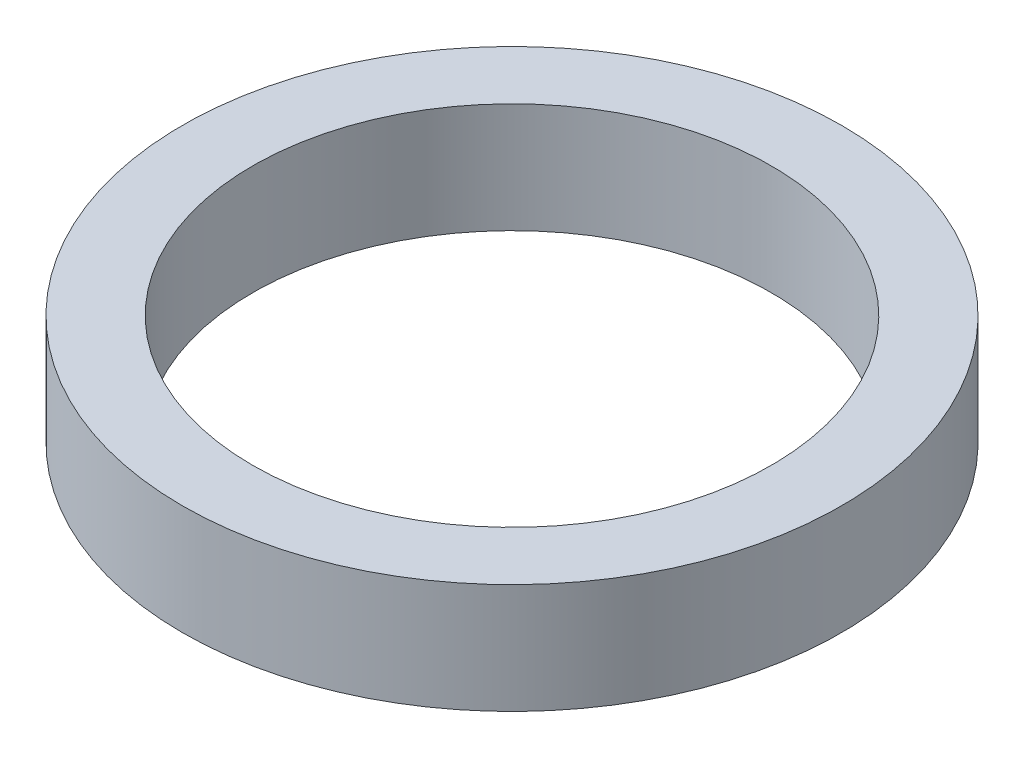
ISO-10303-21;
HEADER;
FILE_DESCRIPTION(('STEP AP214'),'2;1');
FILE_NAME('part.step','',(''),(''),'','','');
FILE_SCHEMA(('AUTOMOTIVE_DESIGN { 1 0 10303 214 1 1 1 1 }'));
ENDSEC;
DATA;
#1=APPLICATION_CONTEXT('core data for automotive mechanical design processes');
#2=APPLICATION_PROTOCOL_DEFINITION('international standard','automotive_design',2000,#1);
#3=PRODUCT_CONTEXT('',#1,'mechanical');
#4=PRODUCT('Part','Part','',(#3));
#5=PRODUCT_RELATED_PRODUCT_CATEGORY('part','',(#4));
#6=PRODUCT_DEFINITION_FORMATION('','',#4);
#7=PRODUCT_DEFINITION_CONTEXT('part definition',#1,'design');
#8=PRODUCT_DEFINITION('design','',#6,#7);
#9=PRODUCT_DEFINITION_SHAPE('','',#8);
#10=(LENGTH_UNIT() NAMED_UNIT(*) SI_UNIT(.MILLI.,.METRE.));
#11=(NAMED_UNIT(*) PLANE_ANGLE_UNIT() SI_UNIT($,.RADIAN.));
#12=(NAMED_UNIT(*) SI_UNIT($,.STERADIAN.) SOLID_ANGLE_UNIT());
#13=UNCERTAINTY_MEASURE_WITH_UNIT(LENGTH_MEASURE(1.E-05),#10,'distance_accuracy_value','');
#14=(GEOMETRIC_REPRESENTATION_CONTEXT(3) GLOBAL_UNCERTAINTY_ASSIGNED_CONTEXT((#13)) GLOBAL_UNIT_ASSIGNED_CONTEXT((#10,
#11,#12)) REPRESENTATION_CONTEXT('',''));
#15=CARTESIAN_POINT('',(0.,0.,0.));
#16=DIRECTION('',(0.,0.,1.));
#17=DIRECTION('',(1.,0.,0.));
#18=AXIS2_PLACEMENT_3D('',#15,#16,#17);
#19=CARTESIAN_POINT('',(0.,1.8,0.));
#20=DIRECTION('',(0.,1.,0.));
#21=DIRECTION('',(0.,0.,1.));
#22=AXIS2_PLACEMENT_3D('',#19,#20,#21);
#23=PLANE('',#22);
#24=CARTESIAN_POINT('',(0.,1.8,0.));
#25=DIRECTION('',(0.,1.,0.));
#26=DIRECTION('',(0.,0.,1.));
#27=AXIS2_PLACEMENT_3D('',#24,#25,#26);
#28=CIRCLE('',#27,5.4);
#29=CARTESIAN_POINT('',(0.,1.8,5.4));
#30=VERTEX_POINT('',#29);
#31=EDGE_CURVE('E10',#30,#30,#28,.T.);
#32=ORIENTED_EDGE('',*,*,#31,.T.);
#33=EDGE_LOOP('',(#32));
#34=FACE_BOUND('',#33,.T.);
#35=CARTESIAN_POINT('',(0.,1.8,0.));
#36=DIRECTION('',(0.,1.,0.));
#37=DIRECTION('',(0.,0.,1.));
#38=AXIS2_PLACEMENT_3D('',#35,#36,#37);
#39=CIRCLE('',#38,4.25);
#40=CARTESIAN_POINT('',(0.,1.8,4.25));
#41=VERTEX_POINT('',#40);
#42=EDGE_CURVE('E42',#41,#41,#39,.T.);
#43=ORIENTED_EDGE('',*,*,#42,.F.);
#44=EDGE_LOOP('',(#43));
#45=FACE_BOUND('',#44,.T.);
#46=ADVANCED_FACE('F31',(#34,#45),#23,.T.);
#47=CARTESIAN_POINT('',(0.,0.,0.));
#48=DIRECTION('',(0.,1.,0.));
#49=DIRECTION('',(0.,0.,1.));
#50=AXIS2_PLACEMENT_3D('',#47,#48,#49);
#51=PLANE('',#50);
#52=CARTESIAN_POINT('',(0.,0.,0.));
#53=DIRECTION('',(0.,1.,0.));
#54=DIRECTION('',(0.,0.,1.));
#55=AXIS2_PLACEMENT_3D('',#52,#53,#54);
#56=CIRCLE('',#55,5.4);
#57=CARTESIAN_POINT('',(0.,0.,5.4));
#58=VERTEX_POINT('',#57);
#59=EDGE_CURVE('E35',#58,#58,#56,.T.);
#60=ORIENTED_EDGE('',*,*,#59,.F.);
#61=EDGE_LOOP('',(#60));
#62=FACE_BOUND('',#61,.T.);
#63=CARTESIAN_POINT('',(0.,0.,0.));
#64=DIRECTION('',(0.,1.,0.));
#65=DIRECTION('',(0.,0.,1.));
#66=AXIS2_PLACEMENT_3D('',#63,#64,#65);
#67=CIRCLE('',#66,4.25);
#68=CARTESIAN_POINT('',(0.,0.,4.25));
#69=VERTEX_POINT('',#68);
#70=EDGE_CURVE('E44',#69,#69,#67,.T.);
#71=ORIENTED_EDGE('',*,*,#70,.T.);
#72=EDGE_LOOP('',(#71));
#73=FACE_BOUND('',#72,.T.);
#74=ADVANCED_FACE('F54',(#62,#73),#51,.F.);
#75=CARTESIAN_POINT('',(0.,1.8,0.));
#76=DIRECTION('',(0.,-1.,0.));
#77=DIRECTION('',(0.,0.,-1.));
#78=AXIS2_PLACEMENT_3D('',#75,#76,#77);
#79=CYLINDRICAL_SURFACE('',#78,5.4);
#80=ORIENTED_EDGE('',*,*,#31,.F.);
#81=EDGE_LOOP('',(#80));
#82=FACE_BOUND('',#81,.T.);
#83=ORIENTED_EDGE('',*,*,#59,.T.);
#84=EDGE_LOOP('',(#83));
#85=FACE_BOUND('',#84,.T.);
#86=ADVANCED_FACE('F33',(#82,#85),#79,.T.);
#87=CARTESIAN_POINT('',(0.,1.8,0.));
#88=DIRECTION('',(0.,-1.,0.));
#89=DIRECTION('',(0.,0.,-1.));
#90=AXIS2_PLACEMENT_3D('',#87,#88,#89);
#91=CYLINDRICAL_SURFACE('',#90,4.25);
#92=ORIENTED_EDGE('',*,*,#42,.T.);
#93=EDGE_LOOP('',(#92));
#94=FACE_BOUND('',#93,.T.);
#95=ORIENTED_EDGE('',*,*,#70,.F.);
#96=EDGE_LOOP('',(#95));
#97=FACE_BOUND('',#96,.T.);
#98=ADVANCED_FACE('F50',(#94,#97),#91,.F.);
#99=CLOSED_SHELL('',(#46,#74,#86,#98));
#100=MANIFOLD_SOLID_BREP('B2',#99);
#101=ADVANCED_BREP_SHAPE_REPRESENTATION('',(#18,#100),#14);
#102=SHAPE_DEFINITION_REPRESENTATION(#9,#101);
ENDSEC;
END-ISO-10303-21;
